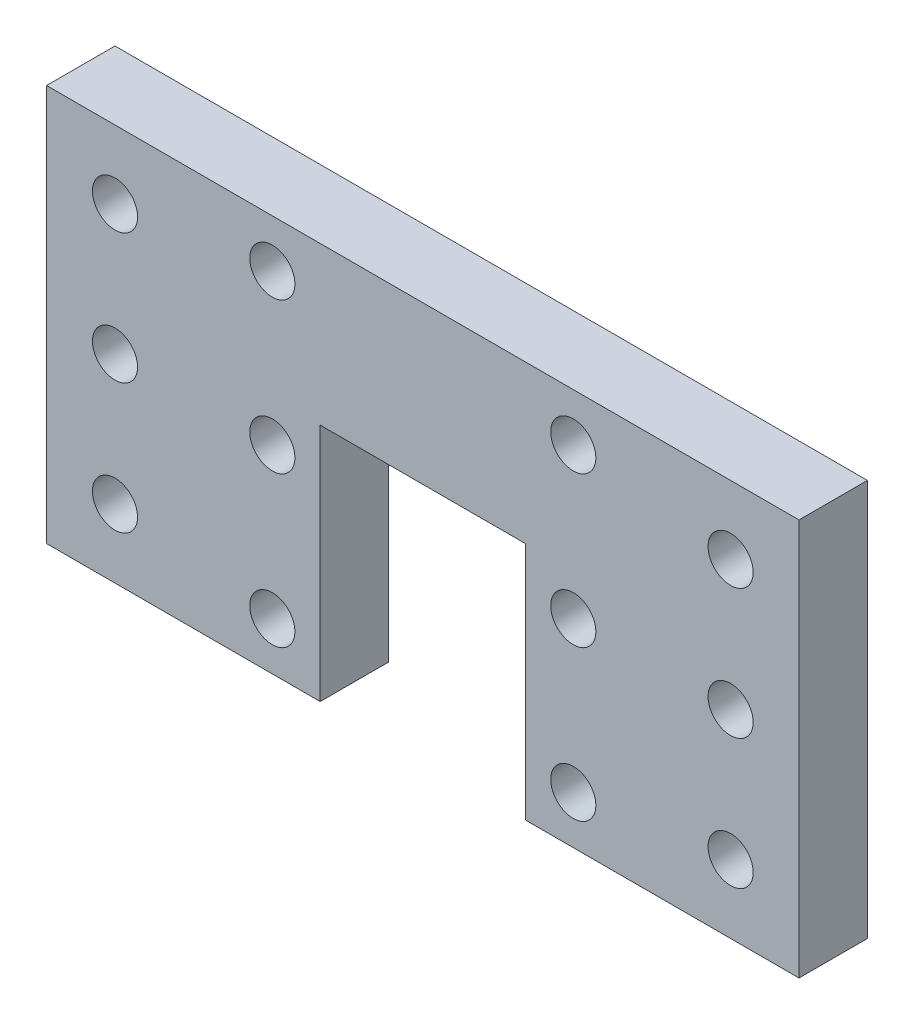
ISO-10303-21;
HEADER;
FILE_DESCRIPTION(('STEP AP214'),'2;1');
FILE_NAME('part.step','',(''),(''),'','','');
FILE_SCHEMA(('AUTOMOTIVE_DESIGN { 1 0 10303 214 1 1 1 1 }'));
ENDSEC;
DATA;
#1=APPLICATION_CONTEXT('core data for automotive mechanical design processes');
#2=APPLICATION_PROTOCOL_DEFINITION('international standard','automotive_design',2000,#1);
#3=PRODUCT_CONTEXT('',#1,'mechanical');
#4=PRODUCT('Part','Part','',(#3));
#5=PRODUCT_RELATED_PRODUCT_CATEGORY('part','',(#4));
#6=PRODUCT_DEFINITION_FORMATION('','',#4);
#7=PRODUCT_DEFINITION_CONTEXT('part definition',#1,'design');
#8=PRODUCT_DEFINITION('design','',#6,#7);
#9=PRODUCT_DEFINITION_SHAPE('','',#8);
#10=(LENGTH_UNIT() NAMED_UNIT(*) SI_UNIT(.MILLI.,.METRE.));
#11=(NAMED_UNIT(*) PLANE_ANGLE_UNIT() SI_UNIT($,.RADIAN.));
#12=(NAMED_UNIT(*) SI_UNIT($,.STERADIAN.) SOLID_ANGLE_UNIT());
#13=UNCERTAINTY_MEASURE_WITH_UNIT(LENGTH_MEASURE(1.E-05),#10,'distance_accuracy_value','');
#14=(GEOMETRIC_REPRESENTATION_CONTEXT(3) GLOBAL_UNCERTAINTY_ASSIGNED_CONTEXT((#13)) GLOBAL_UNIT_ASSIGNED_CONTEXT((#10,
#11,#12)) REPRESENTATION_CONTEXT('',''));
#15=CARTESIAN_POINT('',(0.,0.,0.));
#16=DIRECTION('',(0.,0.,1.));
#17=DIRECTION('',(1.,0.,0.));
#18=AXIS2_PLACEMENT_3D('',#15,#16,#17);
#19=CARTESIAN_POINT('',(-55.,58.,10.));
#20=DIRECTION('',(0.,1.,0.));
#21=DIRECTION('',(-1.,0.,0.));
#22=AXIS2_PLACEMENT_3D('',#19,#20,#21);
#23=PLANE('',#22);
#24=DIRECTION('',(1.,0.,0.));
#25=VECTOR('',#24,1.);
#26=CARTESIAN_POINT('',(-55.,58.,0.));
#27=LINE('',#26,#25);
#28=CARTESIAN_POINT('',(-55.,58.,0.));
#29=VERTEX_POINT('',#28);
#30=CARTESIAN_POINT('',(55.,58.,0.));
#31=VERTEX_POINT('',#30);
#32=EDGE_CURVE('E130',#29,#31,#27,.T.);
#33=ORIENTED_EDGE('',*,*,#32,.F.);
#34=DIRECTION('',(0.,0.,-1.));
#35=VECTOR('',#34,1.);
#36=CARTESIAN_POINT('',(-55.,58.,10.));
#37=LINE('',#36,#35);
#38=CARTESIAN_POINT('',(-55.,58.,10.));
#39=VERTEX_POINT('',#38);
#40=EDGE_CURVE('E11',#39,#29,#37,.T.);
#41=ORIENTED_EDGE('',*,*,#40,.F.);
#42=DIRECTION('',(1.,0.,0.));
#43=VECTOR('',#42,1.);
#44=CARTESIAN_POINT('',(-55.,58.,10.));
#45=LINE('',#44,#43);
#46=CARTESIAN_POINT('',(55.,58.,10.));
#47=VERTEX_POINT('',#46);
#48=EDGE_CURVE('E151',#39,#47,#45,.T.);
#49=ORIENTED_EDGE('',*,*,#48,.T.);
#50=DIRECTION('',(0.,0.,-1.));
#51=VECTOR('',#50,1.);
#52=CARTESIAN_POINT('',(55.,58.,10.));
#53=LINE('',#52,#51);
#54=EDGE_CURVE('E36',#47,#31,#53,.T.);
#55=ORIENTED_EDGE('',*,*,#54,.T.);
#56=EDGE_LOOP('',(#33,#41,#49,#55));
#57=FACE_BOUND('',#56,.T.);
#58=ADVANCED_FACE('F33',(#57),#23,.T.);
#59=CARTESIAN_POINT('',(-55.,0.,10.));
#60=DIRECTION('',(-1.,0.,0.));
#61=DIRECTION('',(0.,0.,1.));
#62=AXIS2_PLACEMENT_3D('',#59,#60,#61);
#63=PLANE('',#62);
#64=DIRECTION('',(0.,1.,0.));
#65=VECTOR('',#64,1.);
#66=CARTESIAN_POINT('',(-55.,0.,0.));
#67=LINE('',#66,#65);
#68=CARTESIAN_POINT('',(-55.,0.,0.));
#69=VERTEX_POINT('',#68);
#70=EDGE_CURVE('E149',#69,#29,#67,.T.);
#71=ORIENTED_EDGE('',*,*,#70,.F.);
#72=DIRECTION('',(0.,0.,-1.));
#73=VECTOR('',#72,1.);
#74=CARTESIAN_POINT('',(-55.,0.,10.));
#75=LINE('',#74,#73);
#76=CARTESIAN_POINT('',(-55.,0.,10.));
#77=VERTEX_POINT('',#76);
#78=EDGE_CURVE('E42',#77,#69,#75,.T.);
#79=ORIENTED_EDGE('',*,*,#78,.F.);
#80=DIRECTION('',(0.,1.,0.));
#81=VECTOR('',#80,1.);
#82=CARTESIAN_POINT('',(-55.,0.,10.));
#83=LINE('',#82,#81);
#84=EDGE_CURVE('E120',#77,#39,#83,.T.);
#85=ORIENTED_EDGE('',*,*,#84,.T.);
#86=ORIENTED_EDGE('',*,*,#40,.T.);
#87=EDGE_LOOP('',(#71,#79,#85,#86));
#88=FACE_BOUND('',#87,.T.);
#89=ADVANCED_FACE('F163',(#88),#63,.T.);
#90=CARTESIAN_POINT('',(-15.0000000000001,0.,10.));
#91=DIRECTION('',(0.,-1.,0.));
#92=DIRECTION('',(1.,0.,0.));
#93=AXIS2_PLACEMENT_3D('',#90,#91,#92);
#94=PLANE('',#93);
#95=DIRECTION('',(-1.,0.,0.));
#96=VECTOR('',#95,1.);
#97=CARTESIAN_POINT('',(-15.0000000000001,0.,0.));
#98=LINE('',#97,#96);
#99=CARTESIAN_POINT('',(-15.0000000000001,0.,0.));
#100=VERTEX_POINT('',#99);
#101=EDGE_CURVE('E107',#100,#69,#98,.T.);
#102=ORIENTED_EDGE('',*,*,#101,.F.);
#103=DIRECTION('',(0.,0.,-1.));
#104=VECTOR('',#103,1.);
#105=CARTESIAN_POINT('',(-15.0000000000001,0.,10.));
#106=LINE('',#105,#104);
#107=CARTESIAN_POINT('',(-15.0000000000001,0.,10.));
#108=VERTEX_POINT('',#107);
#109=EDGE_CURVE('E102',#108,#100,#106,.T.);
#110=ORIENTED_EDGE('',*,*,#109,.F.);
#111=DIRECTION('',(-1.,0.,0.));
#112=VECTOR('',#111,1.);
#113=CARTESIAN_POINT('',(-15.0000000000001,0.,10.));
#114=LINE('',#113,#112);
#115=EDGE_CURVE('E105',#108,#77,#114,.T.);
#116=ORIENTED_EDGE('',*,*,#115,.T.);
#117=ORIENTED_EDGE('',*,*,#78,.T.);
#118=EDGE_LOOP('',(#102,#110,#116,#117));
#119=FACE_BOUND('',#118,.T.);
#120=ADVANCED_FACE('F104',(#119),#94,.T.);
#121=CARTESIAN_POINT('',(-15.0000000000001,35.,10.));
#122=DIRECTION('',(1.,0.,0.));
#123=DIRECTION('',(0.,0.,-1.));
#124=AXIS2_PLACEMENT_3D('',#121,#122,#123);
#125=PLANE('',#124);
#126=DIRECTION('',(0.,-1.,0.));
#127=VECTOR('',#126,1.);
#128=CARTESIAN_POINT('',(-15.0000000000001,35.,0.));
#129=LINE('',#128,#127);
#130=CARTESIAN_POINT('',(-15.0000000000001,35.,0.));
#131=VERTEX_POINT('',#130);
#132=EDGE_CURVE('E146',#131,#100,#129,.T.);
#133=ORIENTED_EDGE('',*,*,#132,.F.);
#134=DIRECTION('',(0.,0.,-1.));
#135=VECTOR('',#134,1.);
#136=CARTESIAN_POINT('',(-15.0000000000001,35.,10.));
#137=LINE('',#136,#135);
#138=CARTESIAN_POINT('',(-15.0000000000001,35.,10.));
#139=VERTEX_POINT('',#138);
#140=EDGE_CURVE('E112',#139,#131,#137,.T.);
#141=ORIENTED_EDGE('',*,*,#140,.F.);
#142=DIRECTION('',(0.,-1.,0.));
#143=VECTOR('',#142,1.);
#144=CARTESIAN_POINT('',(-15.0000000000001,35.,10.));
#145=LINE('',#144,#143);
#146=EDGE_CURVE('E118',#139,#108,#145,.T.);
#147=ORIENTED_EDGE('',*,*,#146,.T.);
#148=ORIENTED_EDGE('',*,*,#109,.T.);
#149=EDGE_LOOP('',(#133,#141,#147,#148));
#150=FACE_BOUND('',#149,.T.);
#151=ADVANCED_FACE('F122',(#150),#125,.T.);
#152=CARTESIAN_POINT('',(14.9999999999999,35.,10.));
#153=DIRECTION('',(0.,-1.,0.));
#154=DIRECTION('',(0.,0.,-1.));
#155=AXIS2_PLACEMENT_3D('',#152,#153,#154);
#156=PLANE('',#155);
#157=DIRECTION('',(-1.,0.,0.));
#158=VECTOR('',#157,1.);
#159=CARTESIAN_POINT('',(14.9999999999999,35.,0.));
#160=LINE('',#159,#158);
#161=CARTESIAN_POINT('',(14.9999999999999,35.,0.));
#162=VERTEX_POINT('',#161);
#163=EDGE_CURVE('E143',#162,#131,#160,.T.);
#164=ORIENTED_EDGE('',*,*,#163,.F.);
#165=DIRECTION('',(0.,0.,-1.));
#166=VECTOR('',#165,1.);
#167=CARTESIAN_POINT('',(14.9999999999999,35.,10.));
#168=LINE('',#167,#166);
#169=CARTESIAN_POINT('',(14.9999999999999,35.,10.));
#170=VERTEX_POINT('',#169);
#171=EDGE_CURVE('E155',#170,#162,#168,.T.);
#172=ORIENTED_EDGE('',*,*,#171,.F.);
#173=DIRECTION('',(-1.,0.,0.));
#174=VECTOR('',#173,1.);
#175=CARTESIAN_POINT('',(14.9999999999999,35.,10.));
#176=LINE('',#175,#174);
#177=EDGE_CURVE('E123',#170,#139,#176,.T.);
#178=ORIENTED_EDGE('',*,*,#177,.T.);
#179=ORIENTED_EDGE('',*,*,#140,.T.);
#180=EDGE_LOOP('',(#164,#172,#178,#179));
#181=FACE_BOUND('',#180,.T.);
#182=ADVANCED_FACE('F176',(#181),#156,.T.);
#183=CARTESIAN_POINT('',(14.9999999999999,0.,10.));
#184=DIRECTION('',(-1.,0.,0.));
#185=DIRECTION('',(0.,0.,1.));
#186=AXIS2_PLACEMENT_3D('',#183,#184,#185);
#187=PLANE('',#186);
#188=DIRECTION('',(0.,1.,0.));
#189=VECTOR('',#188,1.);
#190=CARTESIAN_POINT('',(14.9999999999999,0.,0.));
#191=LINE('',#190,#189);
#192=CARTESIAN_POINT('',(14.9999999999999,0.,0.));
#193=VERTEX_POINT('',#192);
#194=EDGE_CURVE('E140',#193,#162,#191,.T.);
#195=ORIENTED_EDGE('',*,*,#194,.F.);
#196=DIRECTION('',(0.,0.,-1.));
#197=VECTOR('',#196,1.);
#198=CARTESIAN_POINT('',(14.9999999999999,0.,10.));
#199=LINE('',#198,#197);
#200=CARTESIAN_POINT('',(14.9999999999999,0.,10.));
#201=VERTEX_POINT('',#200);
#202=EDGE_CURVE('E157',#201,#193,#199,.T.);
#203=ORIENTED_EDGE('',*,*,#202,.F.);
#204=DIRECTION('',(0.,1.,0.));
#205=VECTOR('',#204,1.);
#206=CARTESIAN_POINT('',(14.9999999999999,0.,10.));
#207=LINE('',#206,#205);
#208=EDGE_CURVE('E125',#201,#170,#207,.T.);
#209=ORIENTED_EDGE('',*,*,#208,.T.);
#210=ORIENTED_EDGE('',*,*,#171,.T.);
#211=EDGE_LOOP('',(#195,#203,#209,#210));
#212=FACE_BOUND('',#211,.T.);
#213=ADVANCED_FACE('F179',(#212),#187,.T.);
#214=CARTESIAN_POINT('',(55.,0.,10.));
#215=DIRECTION('',(0.,-1.,0.));
#216=DIRECTION('',(1.,0.,0.));
#217=AXIS2_PLACEMENT_3D('',#214,#215,#216);
#218=PLANE('',#217);
#219=DIRECTION('',(-1.,0.,0.));
#220=VECTOR('',#219,1.);
#221=CARTESIAN_POINT('',(55.,0.,0.));
#222=LINE('',#221,#220);
#223=CARTESIAN_POINT('',(55.,0.,0.));
#224=VERTEX_POINT('',#223);
#225=EDGE_CURVE('E137',#224,#193,#222,.T.);
#226=ORIENTED_EDGE('',*,*,#225,.F.);
#227=DIRECTION('',(0.,0.,-1.));
#228=VECTOR('',#227,1.);
#229=CARTESIAN_POINT('',(55.,0.,10.));
#230=LINE('',#229,#228);
#231=CARTESIAN_POINT('',(55.,0.,10.));
#232=VERTEX_POINT('',#231);
#233=EDGE_CURVE('E158',#232,#224,#230,.T.);
#234=ORIENTED_EDGE('',*,*,#233,.F.);
#235=DIRECTION('',(-1.,0.,0.));
#236=VECTOR('',#235,1.);
#237=CARTESIAN_POINT('',(55.,0.,10.));
#238=LINE('',#237,#236);
#239=EDGE_CURVE('E325',#232,#201,#238,.T.);
#240=ORIENTED_EDGE('',*,*,#239,.T.);
#241=ORIENTED_EDGE('',*,*,#202,.T.);
#242=EDGE_LOOP('',(#226,#234,#240,#241));
#243=FACE_BOUND('',#242,.T.);
#244=ADVANCED_FACE('F183',(#243),#218,.T.);
#245=CARTESIAN_POINT('',(55.,58.,10.));
#246=DIRECTION('',(1.,0.,0.));
#247=DIRECTION('',(0.,1.,0.));
#248=AXIS2_PLACEMENT_3D('',#245,#246,#247);
#249=PLANE('',#248);
#250=DIRECTION('',(0.,-1.,0.));
#251=VECTOR('',#250,1.);
#252=CARTESIAN_POINT('',(55.,58.,0.));
#253=LINE('',#252,#251);
#254=EDGE_CURVE('E133',#31,#224,#253,.T.);
#255=ORIENTED_EDGE('',*,*,#254,.F.);
#256=ORIENTED_EDGE('',*,*,#54,.F.);
#257=DIRECTION('',(0.,-1.,0.));
#258=VECTOR('',#257,1.);
#259=CARTESIAN_POINT('',(55.,58.,10.));
#260=LINE('',#259,#258);
#261=EDGE_CURVE('E323',#47,#232,#260,.T.);
#262=ORIENTED_EDGE('',*,*,#261,.T.);
#263=ORIENTED_EDGE('',*,*,#233,.T.);
#264=EDGE_LOOP('',(#255,#256,#262,#263));
#265=FACE_BOUND('',#264,.T.);
#266=ADVANCED_FACE('F160',(#265),#249,.T.);
#267=CARTESIAN_POINT('',(0.,0.,10.));
#268=DIRECTION('',(0.,0.,-1.));
#269=DIRECTION('',(-1.,0.,0.));
#270=AXIS2_PLACEMENT_3D('',#267,#268,#269);
#271=PLANE('',#270);
#272=CARTESIAN_POINT('',(44.9999999999999,10.,10.0000000000001));
#273=DIRECTION('',(0.,0.,1.));
#274=DIRECTION('',(1.,0.,0.));
#275=AXIS2_PLACEMENT_3D('',#272,#273,#274);
#276=CIRCLE('',#275,3.29999999999998);
#277=CARTESIAN_POINT('',(48.2999999999999,10.,10.0000000000001));
#278=VERTEX_POINT('',#277);
#279=EDGE_CURVE('E253',#278,#278,#276,.T.);
#280=ORIENTED_EDGE('',*,*,#279,.F.);
#281=EDGE_LOOP('',(#280));
#282=FACE_BOUND('',#281,.T.);
#283=CARTESIAN_POINT('',(44.9999999999999,48.,10.0000000000001));
#284=DIRECTION('',(0.,0.,1.));
#285=DIRECTION('',(1.,0.,0.));
#286=AXIS2_PLACEMENT_3D('',#283,#284,#285);
#287=CIRCLE('',#286,3.29999999999998);
#288=CARTESIAN_POINT('',(48.2999999999999,48.,10.0000000000001));
#289=VERTEX_POINT('',#288);
#290=EDGE_CURVE('E255',#289,#289,#287,.T.);
#291=ORIENTED_EDGE('',*,*,#290,.F.);
#292=EDGE_LOOP('',(#291));
#293=FACE_BOUND('',#292,.T.);
#294=CARTESIAN_POINT('',(22.,6.9999999999999,10.0000000000001));
#295=DIRECTION('',(0.,0.,1.));
#296=DIRECTION('',(1.,0.,0.));
#297=AXIS2_PLACEMENT_3D('',#294,#295,#296);
#298=CIRCLE('',#297,3.29999999999998);
#299=CARTESIAN_POINT('',(25.3,6.9999999999999,10.0000000000001));
#300=VERTEX_POINT('',#299);
#301=EDGE_CURVE('E263',#300,#300,#298,.T.);
#302=ORIENTED_EDGE('',*,*,#301,.F.);
#303=EDGE_LOOP('',(#302));
#304=FACE_BOUND('',#303,.T.);
#305=CARTESIAN_POINT('',(22.,51.0000000000002,10.0000000000001));
#306=DIRECTION('',(0.,0.,1.));
#307=DIRECTION('',(1.,0.,0.));
#308=AXIS2_PLACEMENT_3D('',#305,#306,#307);
#309=CIRCLE('',#308,3.29999999999998);
#310=CARTESIAN_POINT('',(25.3,51.0000000000002,10.0000000000001));
#311=VERTEX_POINT('',#310);
#312=EDGE_CURVE('E269',#311,#311,#309,.T.);
#313=ORIENTED_EDGE('',*,*,#312,.F.);
#314=EDGE_LOOP('',(#313));
#315=FACE_BOUND('',#314,.T.);
#316=CARTESIAN_POINT('',(-22.,6.9999999999999,10.0000000000001));
#317=DIRECTION('',(0.,0.,1.));
#318=DIRECTION('',(1.,0.,0.));
#319=AXIS2_PLACEMENT_3D('',#316,#317,#318);
#320=CIRCLE('',#319,3.29999999999998);
#321=CARTESIAN_POINT('',(-18.7,6.9999999999999,10.0000000000001));
#322=VERTEX_POINT('',#321);
#323=EDGE_CURVE('E275',#322,#322,#320,.T.);
#324=ORIENTED_EDGE('',*,*,#323,.F.);
#325=EDGE_LOOP('',(#324));
#326=FACE_BOUND('',#325,.T.);
#327=CARTESIAN_POINT('',(-22.,51.0000000000002,10.0000000000001));
#328=DIRECTION('',(0.,0.,1.));
#329=DIRECTION('',(1.,0.,0.));
#330=AXIS2_PLACEMENT_3D('',#327,#328,#329);
#331=CIRCLE('',#330,3.29999999999998);
#332=CARTESIAN_POINT('',(-18.7,51.0000000000002,10.0000000000001));
#333=VERTEX_POINT('',#332);
#334=EDGE_CURVE('E281',#333,#333,#331,.T.);
#335=ORIENTED_EDGE('',*,*,#334,.F.);
#336=EDGE_LOOP('',(#335));
#337=FACE_BOUND('',#336,.T.);
#338=CARTESIAN_POINT('',(-45.,9.99999999999979,10.0000000000001));
#339=DIRECTION('',(0.,0.,1.));
#340=DIRECTION('',(1.,0.,0.));
#341=AXIS2_PLACEMENT_3D('',#338,#339,#340);
#342=CIRCLE('',#341,3.29999999999998);
#343=CARTESIAN_POINT('',(-41.7000000000001,9.99999999999979,10.0000000000001));
#344=VERTEX_POINT('',#343);
#345=EDGE_CURVE('E287',#344,#344,#342,.T.);
#346=ORIENTED_EDGE('',*,*,#345,.F.);
#347=EDGE_LOOP('',(#346));
#348=FACE_BOUND('',#347,.T.);
#349=CARTESIAN_POINT('',(-45.0000000000001,47.9999999999998,10.0000000000001));
#350=DIRECTION('',(0.,0.,1.));
#351=DIRECTION('',(1.,0.,0.));
#352=AXIS2_PLACEMENT_3D('',#349,#350,#351);
#353=CIRCLE('',#352,3.29999999999998);
#354=CARTESIAN_POINT('',(-41.7000000000002,47.9999999999998,10.0000000000001));
#355=VERTEX_POINT('',#354);
#356=EDGE_CURVE('E293',#355,#355,#353,.T.);
#357=ORIENTED_EDGE('',*,*,#356,.F.);
#358=EDGE_LOOP('',(#357));
#359=FACE_BOUND('',#358,.T.);
#360=CARTESIAN_POINT('',(44.9999999999999,28.9999999999999,10.0000000000001));
#361=DIRECTION('',(0.,0.,1.));
#362=DIRECTION('',(1.,0.,0.));
#363=AXIS2_PLACEMENT_3D('',#360,#361,#362);
#364=CIRCLE('',#363,3.29999999999998);
#365=CARTESIAN_POINT('',(48.2999999999999,28.9999999999999,10.0000000000001));
#366=VERTEX_POINT('',#365);
#367=EDGE_CURVE('E299',#366,#366,#364,.T.);
#368=ORIENTED_EDGE('',*,*,#367,.F.);
#369=EDGE_LOOP('',(#368));
#370=FACE_BOUND('',#369,.T.);
#371=CARTESIAN_POINT('',(22.,29.0000000000001,10.0000000000001));
#372=DIRECTION('',(0.,0.,1.));
#373=DIRECTION('',(1.,0.,0.));
#374=AXIS2_PLACEMENT_3D('',#371,#372,#373);
#375=CIRCLE('',#374,3.29999999999998);
#376=CARTESIAN_POINT('',(25.3,29.0000000000001,10.0000000000001));
#377=VERTEX_POINT('',#376);
#378=EDGE_CURVE('E305',#377,#377,#375,.T.);
#379=ORIENTED_EDGE('',*,*,#378,.F.);
#380=EDGE_LOOP('',(#379));
#381=FACE_BOUND('',#380,.T.);
#382=CARTESIAN_POINT('',(-22.0000000000001,28.9999999999999,10.0000000000001));
#383=DIRECTION('',(0.,0.,1.));
#384=DIRECTION('',(1.,0.,0.));
#385=AXIS2_PLACEMENT_3D('',#382,#383,#384);
#386=CIRCLE('',#385,3.29999999999998);
#387=CARTESIAN_POINT('',(-18.7000000000002,28.9999999999999,10.0000000000001));
#388=VERTEX_POINT('',#387);
#389=EDGE_CURVE('E311',#388,#388,#386,.T.);
#390=ORIENTED_EDGE('',*,*,#389,.F.);
#391=EDGE_LOOP('',(#390));
#392=FACE_BOUND('',#391,.T.);
#393=CARTESIAN_POINT('',(-45.,28.9999999999999,10.0000000000001));
#394=DIRECTION('',(0.,0.,1.));
#395=DIRECTION('',(1.,0.,0.));
#396=AXIS2_PLACEMENT_3D('',#393,#394,#395);
#397=CIRCLE('',#396,3.29999999999998);
#398=CARTESIAN_POINT('',(-41.7000000000001,28.9999999999999,10.0000000000001));
#399=VERTEX_POINT('',#398);
#400=EDGE_CURVE('E317',#399,#399,#397,.T.);
#401=ORIENTED_EDGE('',*,*,#400,.F.);
#402=EDGE_LOOP('',(#401));
#403=FACE_BOUND('',#402,.T.);
#404=ORIENTED_EDGE('',*,*,#48,.F.);
#405=ORIENTED_EDGE('',*,*,#84,.F.);
#406=ORIENTED_EDGE('',*,*,#115,.F.);
#407=ORIENTED_EDGE('',*,*,#146,.F.);
#408=ORIENTED_EDGE('',*,*,#177,.F.);
#409=ORIENTED_EDGE('',*,*,#208,.F.);
#410=ORIENTED_EDGE('',*,*,#239,.F.);
#411=ORIENTED_EDGE('',*,*,#261,.F.);
#412=EDGE_LOOP('',(#404,#405,#406,#407,#408,#409,#410,#411));
#413=FACE_BOUND('',#412,.T.);
#414=ADVANCED_FACE('F116',(#282,#293,#304,#315,#326,#337,#348,#359,#370,#381,#392,#403,#413),
#271,.F.);
#415=CARTESIAN_POINT('',(0.,0.,0.));
#416=DIRECTION('',(0.,0.,-1.));
#417=DIRECTION('',(-1.,0.,0.));
#418=AXIS2_PLACEMENT_3D('',#415,#416,#417);
#419=PLANE('',#418);
#420=CARTESIAN_POINT('',(44.9999999999999,10.,0.));
#421=DIRECTION('',(0.,0.,1.));
#422=DIRECTION('',(1.,0.,0.));
#423=AXIS2_PLACEMENT_3D('',#420,#421,#422);
#424=CIRCLE('',#423,3.29999999999998);
#425=CARTESIAN_POINT('',(48.2999999999999,10.,0.));
#426=VERTEX_POINT('',#425);
#427=EDGE_CURVE('E251',#426,#426,#424,.T.);
#428=ORIENTED_EDGE('',*,*,#427,.T.);
#429=EDGE_LOOP('',(#428));
#430=FACE_BOUND('',#429,.T.);
#431=CARTESIAN_POINT('',(44.9999999999999,48.,0.));
#432=DIRECTION('',(0.,0.,1.));
#433=DIRECTION('',(1.,0.,0.));
#434=AXIS2_PLACEMENT_3D('',#431,#432,#433);
#435=CIRCLE('',#434,3.29999999999998);
#436=CARTESIAN_POINT('',(48.2999999999999,48.,0.));
#437=VERTEX_POINT('',#436);
#438=EDGE_CURVE('E260',#437,#437,#435,.T.);
#439=ORIENTED_EDGE('',*,*,#438,.T.);
#440=EDGE_LOOP('',(#439));
#441=FACE_BOUND('',#440,.T.);
#442=CARTESIAN_POINT('',(22.,6.9999999999999,0.));
#443=DIRECTION('',(0.,0.,1.));
#444=DIRECTION('',(1.,0.,0.));
#445=AXIS2_PLACEMENT_3D('',#442,#443,#444);
#446=CIRCLE('',#445,3.29999999999998);
#447=CARTESIAN_POINT('',(25.3,6.9999999999999,0.));
#448=VERTEX_POINT('',#447);
#449=EDGE_CURVE('E266',#448,#448,#446,.T.);
#450=ORIENTED_EDGE('',*,*,#449,.T.);
#451=EDGE_LOOP('',(#450));
#452=FACE_BOUND('',#451,.T.);
#453=CARTESIAN_POINT('',(22.,51.0000000000002,0.));
#454=DIRECTION('',(0.,0.,1.));
#455=DIRECTION('',(1.,0.,0.));
#456=AXIS2_PLACEMENT_3D('',#453,#454,#455);
#457=CIRCLE('',#456,3.29999999999998);
#458=CARTESIAN_POINT('',(25.3,51.0000000000002,0.));
#459=VERTEX_POINT('',#458);
#460=EDGE_CURVE('E272',#459,#459,#457,.T.);
#461=ORIENTED_EDGE('',*,*,#460,.T.);
#462=EDGE_LOOP('',(#461));
#463=FACE_BOUND('',#462,.T.);
#464=CARTESIAN_POINT('',(-22.,6.9999999999999,0.));
#465=DIRECTION('',(0.,0.,1.));
#466=DIRECTION('',(1.,0.,0.));
#467=AXIS2_PLACEMENT_3D('',#464,#465,#466);
#468=CIRCLE('',#467,3.29999999999998);
#469=CARTESIAN_POINT('',(-18.7,6.9999999999999,0.));
#470=VERTEX_POINT('',#469);
#471=EDGE_CURVE('E278',#470,#470,#468,.T.);
#472=ORIENTED_EDGE('',*,*,#471,.T.);
#473=EDGE_LOOP('',(#472));
#474=FACE_BOUND('',#473,.T.);
#475=CARTESIAN_POINT('',(-22.,51.0000000000002,0.));
#476=DIRECTION('',(0.,0.,1.));
#477=DIRECTION('',(1.,0.,0.));
#478=AXIS2_PLACEMENT_3D('',#475,#476,#477);
#479=CIRCLE('',#478,3.29999999999998);
#480=CARTESIAN_POINT('',(-18.7,51.0000000000002,0.));
#481=VERTEX_POINT('',#480);
#482=EDGE_CURVE('E284',#481,#481,#479,.T.);
#483=ORIENTED_EDGE('',*,*,#482,.T.);
#484=EDGE_LOOP('',(#483));
#485=FACE_BOUND('',#484,.T.);
#486=CARTESIAN_POINT('',(-45.,9.99999999999979,0.));
#487=DIRECTION('',(0.,0.,1.));
#488=DIRECTION('',(1.,0.,0.));
#489=AXIS2_PLACEMENT_3D('',#486,#487,#488);
#490=CIRCLE('',#489,3.29999999999998);
#491=CARTESIAN_POINT('',(-41.7000000000001,9.99999999999979,0.));
#492=VERTEX_POINT('',#491);
#493=EDGE_CURVE('E290',#492,#492,#490,.T.);
#494=ORIENTED_EDGE('',*,*,#493,.T.);
#495=EDGE_LOOP('',(#494));
#496=FACE_BOUND('',#495,.T.);
#497=CARTESIAN_POINT('',(-45.0000000000001,47.9999999999998,0.));
#498=DIRECTION('',(0.,0.,1.));
#499=DIRECTION('',(1.,0.,0.));
#500=AXIS2_PLACEMENT_3D('',#497,#498,#499);
#501=CIRCLE('',#500,3.29999999999998);
#502=CARTESIAN_POINT('',(-41.7000000000002,47.9999999999998,0.));
#503=VERTEX_POINT('',#502);
#504=EDGE_CURVE('E296',#503,#503,#501,.T.);
#505=ORIENTED_EDGE('',*,*,#504,.T.);
#506=EDGE_LOOP('',(#505));
#507=FACE_BOUND('',#506,.T.);
#508=CARTESIAN_POINT('',(44.9999999999999,28.9999999999999,0.));
#509=DIRECTION('',(0.,0.,1.));
#510=DIRECTION('',(1.,0.,0.));
#511=AXIS2_PLACEMENT_3D('',#508,#509,#510);
#512=CIRCLE('',#511,3.29999999999998);
#513=CARTESIAN_POINT('',(48.2999999999999,28.9999999999999,0.));
#514=VERTEX_POINT('',#513);
#515=EDGE_CURVE('E302',#514,#514,#512,.T.);
#516=ORIENTED_EDGE('',*,*,#515,.T.);
#517=EDGE_LOOP('',(#516));
#518=FACE_BOUND('',#517,.T.);
#519=CARTESIAN_POINT('',(22.,29.0000000000001,0.));
#520=DIRECTION('',(0.,0.,1.));
#521=DIRECTION('',(1.,0.,0.));
#522=AXIS2_PLACEMENT_3D('',#519,#520,#521);
#523=CIRCLE('',#522,3.29999999999998);
#524=CARTESIAN_POINT('',(25.3,29.0000000000001,0.));
#525=VERTEX_POINT('',#524);
#526=EDGE_CURVE('E308',#525,#525,#523,.T.);
#527=ORIENTED_EDGE('',*,*,#526,.T.);
#528=EDGE_LOOP('',(#527));
#529=FACE_BOUND('',#528,.T.);
#530=CARTESIAN_POINT('',(-22.0000000000001,28.9999999999999,0.));
#531=DIRECTION('',(0.,0.,1.));
#532=DIRECTION('',(1.,0.,0.));
#533=AXIS2_PLACEMENT_3D('',#530,#531,#532);
#534=CIRCLE('',#533,3.29999999999998);
#535=CARTESIAN_POINT('',(-18.7000000000002,28.9999999999999,0.));
#536=VERTEX_POINT('',#535);
#537=EDGE_CURVE('E314',#536,#536,#534,.T.);
#538=ORIENTED_EDGE('',*,*,#537,.T.);
#539=EDGE_LOOP('',(#538));
#540=FACE_BOUND('',#539,.T.);
#541=CARTESIAN_POINT('',(-45.,28.9999999999999,0.));
#542=DIRECTION('',(0.,0.,1.));
#543=DIRECTION('',(1.,0.,0.));
#544=AXIS2_PLACEMENT_3D('',#541,#542,#543);
#545=CIRCLE('',#544,3.29999999999998);
#546=CARTESIAN_POINT('',(-41.7000000000001,28.9999999999999,0.));
#547=VERTEX_POINT('',#546);
#548=EDGE_CURVE('E134',#547,#547,#545,.T.);
#549=ORIENTED_EDGE('',*,*,#548,.T.);
#550=EDGE_LOOP('',(#549));
#551=FACE_BOUND('',#550,.T.);
#552=ORIENTED_EDGE('',*,*,#32,.T.);
#553=ORIENTED_EDGE('',*,*,#254,.T.);
#554=ORIENTED_EDGE('',*,*,#225,.T.);
#555=ORIENTED_EDGE('',*,*,#194,.T.);
#556=ORIENTED_EDGE('',*,*,#163,.T.);
#557=ORIENTED_EDGE('',*,*,#132,.T.);
#558=ORIENTED_EDGE('',*,*,#101,.T.);
#559=ORIENTED_EDGE('',*,*,#70,.T.);
#560=EDGE_LOOP('',(#552,#553,#554,#555,#556,#557,#558,#559));
#561=FACE_BOUND('',#560,.T.);
#562=ADVANCED_FACE('F162',(#430,#441,#452,#463,#474,#485,#496,#507,#518,#529,#540,#551,#561),
#419,.T.);
#563=CARTESIAN_POINT('',(-45.,28.9999999999999,10.0000000000001));
#564=DIRECTION('',(0.,0.,1.));
#565=DIRECTION('',(1.,0.,0.));
#566=AXIS2_PLACEMENT_3D('',#563,#564,#565);
#567=CYLINDRICAL_SURFACE('',#566,3.29999999999998);
#568=ORIENTED_EDGE('',*,*,#548,.F.);
#569=EDGE_LOOP('',(#568));
#570=FACE_BOUND('',#569,.T.);
#571=ORIENTED_EDGE('',*,*,#400,.T.);
#572=EDGE_LOOP('',(#571));
#573=FACE_BOUND('',#572,.T.);
#574=ADVANCED_FACE('F195',(#570,#573),#567,.F.);
#575=CARTESIAN_POINT('',(-22.0000000000001,28.9999999999999,10.0000000000001));
#576=DIRECTION('',(0.,0.,1.));
#577=DIRECTION('',(1.,0.,0.));
#578=AXIS2_PLACEMENT_3D('',#575,#576,#577);
#579=CYLINDRICAL_SURFACE('',#578,3.29999999999998);
#580=ORIENTED_EDGE('',*,*,#537,.F.);
#581=EDGE_LOOP('',(#580));
#582=FACE_BOUND('',#581,.T.);
#583=ORIENTED_EDGE('',*,*,#389,.T.);
#584=EDGE_LOOP('',(#583));
#585=FACE_BOUND('',#584,.T.);
#586=ADVANCED_FACE('F202',(#582,#585),#579,.F.);
#587=CARTESIAN_POINT('',(22.,29.0000000000001,10.0000000000001));
#588=DIRECTION('',(0.,0.,1.));
#589=DIRECTION('',(1.,0.,0.));
#590=AXIS2_PLACEMENT_3D('',#587,#588,#589);
#591=CYLINDRICAL_SURFACE('',#590,3.29999999999998);
#592=ORIENTED_EDGE('',*,*,#526,.F.);
#593=EDGE_LOOP('',(#592));
#594=FACE_BOUND('',#593,.T.);
#595=ORIENTED_EDGE('',*,*,#378,.T.);
#596=EDGE_LOOP('',(#595));
#597=FACE_BOUND('',#596,.T.);
#598=ADVANCED_FACE('F206',(#594,#597),#591,.F.);
#599=CARTESIAN_POINT('',(44.9999999999999,28.9999999999999,10.0000000000001));
#600=DIRECTION('',(0.,0.,1.));
#601=DIRECTION('',(1.,0.,0.));
#602=AXIS2_PLACEMENT_3D('',#599,#600,#601);
#603=CYLINDRICAL_SURFACE('',#602,3.29999999999998);
#604=ORIENTED_EDGE('',*,*,#515,.F.);
#605=EDGE_LOOP('',(#604));
#606=FACE_BOUND('',#605,.T.);
#607=ORIENTED_EDGE('',*,*,#367,.T.);
#608=EDGE_LOOP('',(#607));
#609=FACE_BOUND('',#608,.T.);
#610=ADVANCED_FACE('F210',(#606,#609),#603,.F.);
#611=CARTESIAN_POINT('',(-45.0000000000001,47.9999999999998,10.0000000000001));
#612=DIRECTION('',(0.,0.,1.));
#613=DIRECTION('',(1.,0.,0.));
#614=AXIS2_PLACEMENT_3D('',#611,#612,#613);
#615=CYLINDRICAL_SURFACE('',#614,3.29999999999998);
#616=ORIENTED_EDGE('',*,*,#504,.F.);
#617=EDGE_LOOP('',(#616));
#618=FACE_BOUND('',#617,.T.);
#619=ORIENTED_EDGE('',*,*,#356,.T.);
#620=EDGE_LOOP('',(#619));
#621=FACE_BOUND('',#620,.T.);
#622=ADVANCED_FACE('F214',(#618,#621),#615,.F.);
#623=CARTESIAN_POINT('',(-45.,9.99999999999979,10.0000000000001));
#624=DIRECTION('',(0.,0.,1.));
#625=DIRECTION('',(1.,0.,0.));
#626=AXIS2_PLACEMENT_3D('',#623,#624,#625);
#627=CYLINDRICAL_SURFACE('',#626,3.29999999999998);
#628=ORIENTED_EDGE('',*,*,#493,.F.);
#629=EDGE_LOOP('',(#628));
#630=FACE_BOUND('',#629,.T.);
#631=ORIENTED_EDGE('',*,*,#345,.T.);
#632=EDGE_LOOP('',(#631));
#633=FACE_BOUND('',#632,.T.);
#634=ADVANCED_FACE('F218',(#630,#633),#627,.F.);
#635=CARTESIAN_POINT('',(-22.,51.0000000000002,10.0000000000001));
#636=DIRECTION('',(0.,0.,1.));
#637=DIRECTION('',(1.,0.,0.));
#638=AXIS2_PLACEMENT_3D('',#635,#636,#637);
#639=CYLINDRICAL_SURFACE('',#638,3.29999999999998);
#640=ORIENTED_EDGE('',*,*,#482,.F.);
#641=EDGE_LOOP('',(#640));
#642=FACE_BOUND('',#641,.T.);
#643=ORIENTED_EDGE('',*,*,#334,.T.);
#644=EDGE_LOOP('',(#643));
#645=FACE_BOUND('',#644,.T.);
#646=ADVANCED_FACE('F222',(#642,#645),#639,.F.);
#647=CARTESIAN_POINT('',(-22.,6.9999999999999,10.0000000000001));
#648=DIRECTION('',(0.,0.,1.));
#649=DIRECTION('',(1.,0.,0.));
#650=AXIS2_PLACEMENT_3D('',#647,#648,#649);
#651=CYLINDRICAL_SURFACE('',#650,3.29999999999998);
#652=ORIENTED_EDGE('',*,*,#471,.F.);
#653=EDGE_LOOP('',(#652));
#654=FACE_BOUND('',#653,.T.);
#655=ORIENTED_EDGE('',*,*,#323,.T.);
#656=EDGE_LOOP('',(#655));
#657=FACE_BOUND('',#656,.T.);
#658=ADVANCED_FACE('F226',(#654,#657),#651,.F.);
#659=CARTESIAN_POINT('',(22.,51.0000000000002,10.0000000000001));
#660=DIRECTION('',(0.,0.,1.));
#661=DIRECTION('',(1.,0.,0.));
#662=AXIS2_PLACEMENT_3D('',#659,#660,#661);
#663=CYLINDRICAL_SURFACE('',#662,3.29999999999998);
#664=ORIENTED_EDGE('',*,*,#460,.F.);
#665=EDGE_LOOP('',(#664));
#666=FACE_BOUND('',#665,.T.);
#667=ORIENTED_EDGE('',*,*,#312,.T.);
#668=EDGE_LOOP('',(#667));
#669=FACE_BOUND('',#668,.T.);
#670=ADVANCED_FACE('F230',(#666,#669),#663,.F.);
#671=CARTESIAN_POINT('',(22.,6.9999999999999,10.0000000000001));
#672=DIRECTION('',(0.,0.,1.));
#673=DIRECTION('',(1.,0.,0.));
#674=AXIS2_PLACEMENT_3D('',#671,#672,#673);
#675=CYLINDRICAL_SURFACE('',#674,3.29999999999998);
#676=ORIENTED_EDGE('',*,*,#449,.F.);
#677=EDGE_LOOP('',(#676));
#678=FACE_BOUND('',#677,.T.);
#679=ORIENTED_EDGE('',*,*,#301,.T.);
#680=EDGE_LOOP('',(#679));
#681=FACE_BOUND('',#680,.T.);
#682=ADVANCED_FACE('F234',(#678,#681),#675,.F.);
#683=CARTESIAN_POINT('',(44.9999999999999,48.,10.0000000000001));
#684=DIRECTION('',(0.,0.,1.));
#685=DIRECTION('',(1.,0.,0.));
#686=AXIS2_PLACEMENT_3D('',#683,#684,#685);
#687=CYLINDRICAL_SURFACE('',#686,3.29999999999998);
#688=ORIENTED_EDGE('',*,*,#438,.F.);
#689=EDGE_LOOP('',(#688));
#690=FACE_BOUND('',#689,.T.);
#691=ORIENTED_EDGE('',*,*,#290,.T.);
#692=EDGE_LOOP('',(#691));
#693=FACE_BOUND('',#692,.T.);
#694=ADVANCED_FACE('F238',(#690,#693),#687,.F.);
#695=CARTESIAN_POINT('',(44.9999999999999,10.,10.0000000000001));
#696=DIRECTION('',(0.,0.,1.));
#697=DIRECTION('',(1.,0.,0.));
#698=AXIS2_PLACEMENT_3D('',#695,#696,#697);
#699=CYLINDRICAL_SURFACE('',#698,3.29999999999998);
#700=ORIENTED_EDGE('',*,*,#427,.F.);
#701=EDGE_LOOP('',(#700));
#702=FACE_BOUND('',#701,.T.);
#703=ORIENTED_EDGE('',*,*,#279,.T.);
#704=EDGE_LOOP('',(#703));
#705=FACE_BOUND('',#704,.T.);
#706=ADVANCED_FACE('F242',(#702,#705),#699,.F.);
#707=CLOSED_SHELL('',(#58,#89,#120,#151,#182,#213,#244,#266,#414,#562,#574,#586,#598,#610,#622,
#634,#646,#658,#670,#682,#694,#706));
#708=MANIFOLD_SOLID_BREP('B2',#707);
#709=ADVANCED_BREP_SHAPE_REPRESENTATION('',(#18,#708),#14);
#710=SHAPE_DEFINITION_REPRESENTATION(#9,#709);
ENDSEC;
END-ISO-10303-21;
